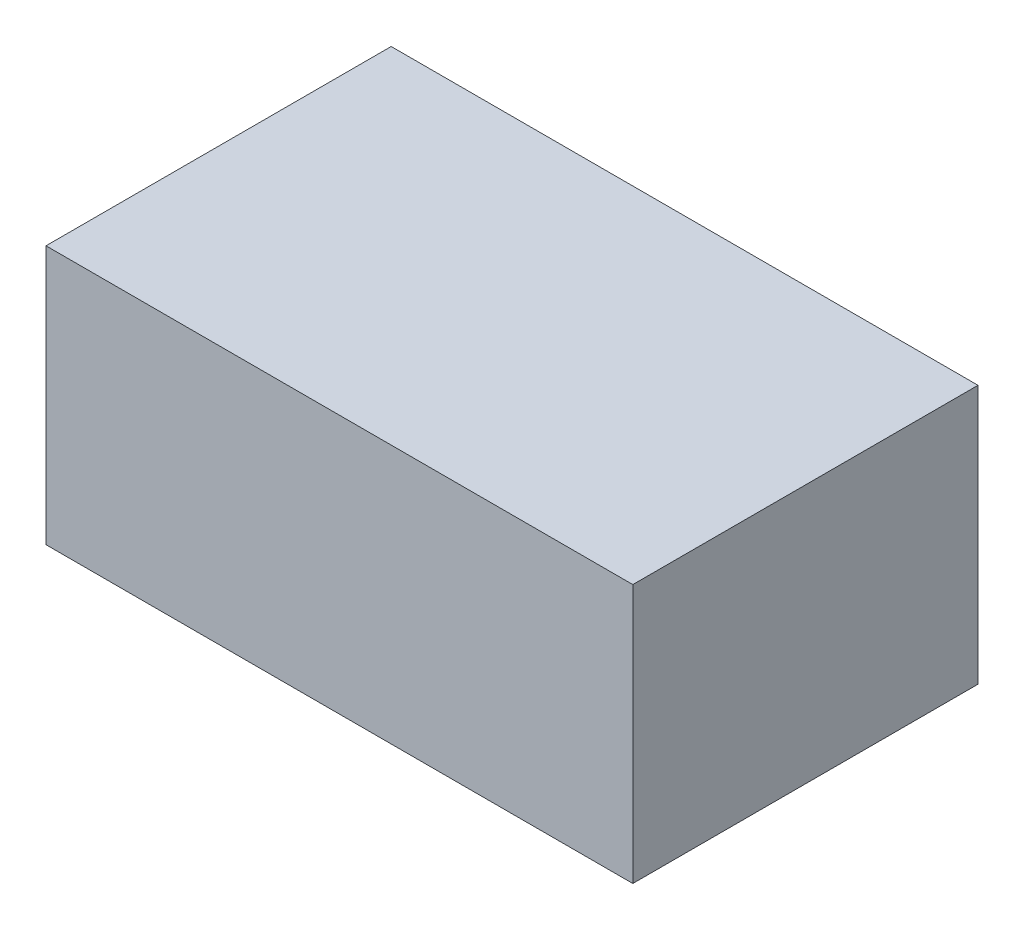
ISO-10303-21;
HEADER;
FILE_DESCRIPTION(('STEP AP214'),'2;1');
FILE_NAME('part.step','',(''),(''),'','','');
FILE_SCHEMA(('AUTOMOTIVE_DESIGN { 1 0 10303 214 1 1 1 1 }'));
ENDSEC;
DATA;
#1=APPLICATION_CONTEXT('core data for automotive mechanical design processes');
#2=APPLICATION_PROTOCOL_DEFINITION('international standard','automotive_design',2000,#1);
#3=PRODUCT_CONTEXT('',#1,'mechanical');
#4=PRODUCT('Part','Part','',(#3));
#5=PRODUCT_RELATED_PRODUCT_CATEGORY('part','',(#4));
#6=PRODUCT_DEFINITION_FORMATION('','',#4);
#7=PRODUCT_DEFINITION_CONTEXT('part definition',#1,'design');
#8=PRODUCT_DEFINITION('design','',#6,#7);
#9=PRODUCT_DEFINITION_SHAPE('','',#8);
#10=(LENGTH_UNIT() NAMED_UNIT(*) SI_UNIT(.MILLI.,.METRE.));
#11=(NAMED_UNIT(*) PLANE_ANGLE_UNIT() SI_UNIT($,.RADIAN.));
#12=(NAMED_UNIT(*) SI_UNIT($,.STERADIAN.) SOLID_ANGLE_UNIT());
#13=UNCERTAINTY_MEASURE_WITH_UNIT(LENGTH_MEASURE(1.E-05),#10,'distance_accuracy_value','');
#14=(GEOMETRIC_REPRESENTATION_CONTEXT(3) GLOBAL_UNCERTAINTY_ASSIGNED_CONTEXT((#13)) GLOBAL_UNIT_ASSIGNED_CONTEXT((#10,
#11,#12)) REPRESENTATION_CONTEXT('',''));
#15=CARTESIAN_POINT('',(0.,0.,0.));
#16=DIRECTION('',(0.,0.,1.));
#17=DIRECTION('',(1.,0.,0.));
#18=AXIS2_PLACEMENT_3D('',#15,#16,#17);
#19=CARTESIAN_POINT('',(34.,-15.,40.));
#20=DIRECTION('',(-1.,0.,0.));
#21=DIRECTION('',(0.,0.,1.));
#22=AXIS2_PLACEMENT_3D('',#19,#20,#21);
#23=PLANE('',#22);
#24=DIRECTION('',(0.,1.,0.));
#25=VECTOR('',#24,1.);
#26=CARTESIAN_POINT('',(34.,-15.,0.));
#27=LINE('',#26,#25);
#28=CARTESIAN_POINT('',(34.,-15.,0.));
#29=VERTEX_POINT('',#28);
#30=CARTESIAN_POINT('',(34.,15.,0.));
#31=VERTEX_POINT('',#30);
#32=EDGE_CURVE('E107',#29,#31,#27,.T.);
#33=ORIENTED_EDGE('',*,*,#32,.T.);
#34=DIRECTION('',(0.,0.,-1.));
#35=VECTOR('',#34,1.);
#36=CARTESIAN_POINT('',(34.,15.,40.));
#37=LINE('',#36,#35);
#38=CARTESIAN_POINT('',(34.,15.,40.));
#39=VERTEX_POINT('',#38);
#40=EDGE_CURVE('E11',#39,#31,#37,.T.);
#41=ORIENTED_EDGE('',*,*,#40,.F.);
#42=DIRECTION('',(0.,1.,0.));
#43=VECTOR('',#42,1.);
#44=CARTESIAN_POINT('',(34.,-15.,40.));
#45=LINE('',#44,#43);
#46=CARTESIAN_POINT('',(34.,-15.,40.));
#47=VERTEX_POINT('',#46);
#48=EDGE_CURVE('E91',#47,#39,#45,.T.);
#49=ORIENTED_EDGE('',*,*,#48,.F.);
#50=DIRECTION('',(0.,0.,-1.));
#51=VECTOR('',#50,1.);
#52=CARTESIAN_POINT('',(34.,-15.,40.));
#53=LINE('',#52,#51);
#54=EDGE_CURVE('E103',#47,#29,#53,.T.);
#55=ORIENTED_EDGE('',*,*,#54,.T.);
#56=EDGE_LOOP('',(#33,#41,#49,#55));
#57=FACE_BOUND('',#56,.T.);
#58=ADVANCED_FACE('F39',(#57),#23,.F.);
#59=CARTESIAN_POINT('',(-34.,15.,40.));
#60=DIRECTION('',(0.,-1.,0.));
#61=DIRECTION('',(0.,0.,-1.));
#62=AXIS2_PLACEMENT_3D('',#59,#60,#61);
#63=PLANE('',#62);
#64=DIRECTION('',(-1.,0.,0.));
#65=VECTOR('',#64,1.);
#66=CARTESIAN_POINT('',(-34.,15.,0.));
#67=LINE('',#66,#65);
#68=CARTESIAN_POINT('',(-34.,15.,0.));
#69=VERTEX_POINT('',#68);
#70=EDGE_CURVE('E96',#31,#69,#67,.T.);
#71=ORIENTED_EDGE('',*,*,#70,.T.);
#72=DIRECTION('',(0.,0.,-1.));
#73=VECTOR('',#72,1.);
#74=CARTESIAN_POINT('',(-34.,15.,40.));
#75=LINE('',#74,#73);
#76=CARTESIAN_POINT('',(-34.,15.,40.));
#77=VERTEX_POINT('',#76);
#78=EDGE_CURVE('E48',#77,#69,#75,.T.);
#79=ORIENTED_EDGE('',*,*,#78,.F.);
#80=DIRECTION('',(-1.,0.,0.));
#81=VECTOR('',#80,1.);
#82=CARTESIAN_POINT('',(-34.,15.,40.));
#83=LINE('',#82,#81);
#84=EDGE_CURVE('E86',#39,#77,#83,.T.);
#85=ORIENTED_EDGE('',*,*,#84,.F.);
#86=ORIENTED_EDGE('',*,*,#40,.T.);
#87=EDGE_LOOP('',(#71,#79,#85,#86));
#88=FACE_BOUND('',#87,.T.);
#89=ADVANCED_FACE('F95',(#88),#63,.F.);
#90=CARTESIAN_POINT('',(-34.,-15.,40.));
#91=DIRECTION('',(1.,0.,0.));
#92=DIRECTION('',(0.,0.,-1.));
#93=AXIS2_PLACEMENT_3D('',#90,#91,#92);
#94=PLANE('',#93);
#95=DIRECTION('',(0.,-1.,0.));
#96=VECTOR('',#95,1.);
#97=CARTESIAN_POINT('',(-34.,-15.,0.));
#98=LINE('',#97,#96);
#99=CARTESIAN_POINT('',(-34.,-15.,0.));
#100=VERTEX_POINT('',#99);
#101=EDGE_CURVE('E73',#69,#100,#98,.T.);
#102=ORIENTED_EDGE('',*,*,#101,.T.);
#103=DIRECTION('',(0.,0.,-1.));
#104=VECTOR('',#103,1.);
#105=CARTESIAN_POINT('',(-34.,-15.,40.));
#106=LINE('',#105,#104);
#107=CARTESIAN_POINT('',(-34.,-15.,40.));
#108=VERTEX_POINT('',#107);
#109=EDGE_CURVE('E98',#108,#100,#106,.T.);
#110=ORIENTED_EDGE('',*,*,#109,.F.);
#111=DIRECTION('',(0.,-1.,0.));
#112=VECTOR('',#111,1.);
#113=CARTESIAN_POINT('',(-34.,-15.,40.));
#114=LINE('',#113,#112);
#115=EDGE_CURVE('E89',#77,#108,#114,.T.);
#116=ORIENTED_EDGE('',*,*,#115,.F.);
#117=ORIENTED_EDGE('',*,*,#78,.T.);
#118=EDGE_LOOP('',(#102,#110,#116,#117));
#119=FACE_BOUND('',#118,.T.);
#120=ADVANCED_FACE('F99',(#119),#94,.F.);
#121=CARTESIAN_POINT('',(-34.,-15.,40.));
#122=DIRECTION('',(0.,1.,0.));
#123=DIRECTION('',(0.,0.,1.));
#124=AXIS2_PLACEMENT_3D('',#121,#122,#123);
#125=PLANE('',#124);
#126=DIRECTION('',(1.,0.,0.));
#127=VECTOR('',#126,1.);
#128=CARTESIAN_POINT('',(-34.,-15.,0.));
#129=LINE('',#128,#127);
#130=EDGE_CURVE('E79',#100,#29,#129,.T.);
#131=ORIENTED_EDGE('',*,*,#130,.T.);
#132=ORIENTED_EDGE('',*,*,#54,.F.);
#133=DIRECTION('',(1.,0.,0.));
#134=VECTOR('',#133,1.);
#135=CARTESIAN_POINT('',(-34.,-15.,40.));
#136=LINE('',#135,#134);
#137=EDGE_CURVE('E56',#108,#47,#136,.T.);
#138=ORIENTED_EDGE('',*,*,#137,.F.);
#139=ORIENTED_EDGE('',*,*,#109,.T.);
#140=EDGE_LOOP('',(#131,#132,#138,#139));
#141=FACE_BOUND('',#140,.T.);
#142=ADVANCED_FACE('F120',(#141),#125,.F.);
#143=CARTESIAN_POINT('',(0.,0.,40.));
#144=DIRECTION('',(0.,0.,-1.));
#145=DIRECTION('',(-1.,0.,0.));
#146=AXIS2_PLACEMENT_3D('',#143,#144,#145);
#147=PLANE('',#146);
#148=ORIENTED_EDGE('',*,*,#48,.T.);
#149=ORIENTED_EDGE('',*,*,#84,.T.);
#150=ORIENTED_EDGE('',*,*,#115,.T.);
#151=ORIENTED_EDGE('',*,*,#137,.T.);
#152=EDGE_LOOP('',(#148,#149,#150,#151));
#153=FACE_BOUND('',#152,.T.);
#154=ADVANCED_FACE('F87',(#153),#147,.F.);
#155=CARTESIAN_POINT('',(0.,0.,0.));
#156=DIRECTION('',(0.,0.,-1.));
#157=DIRECTION('',(-1.,0.,0.));
#158=AXIS2_PLACEMENT_3D('',#155,#156,#157);
#159=PLANE('',#158);
#160=ORIENTED_EDGE('',*,*,#32,.F.);
#161=ORIENTED_EDGE('',*,*,#130,.F.);
#162=ORIENTED_EDGE('',*,*,#101,.F.);
#163=ORIENTED_EDGE('',*,*,#70,.F.);
#164=EDGE_LOOP('',(#160,#161,#162,#163));
#165=FACE_BOUND('',#164,.T.);
#166=ADVANCED_FACE('F123',(#165),#159,.T.);
#167=CLOSED_SHELL('',(#58,#89,#120,#142,#154,#166));
#168=MANIFOLD_SOLID_BREP('B2',#167);
#169=ADVANCED_BREP_SHAPE_REPRESENTATION('',(#18,#168),#14);
#170=SHAPE_DEFINITION_REPRESENTATION(#9,#169);
ENDSEC;
END-ISO-10303-21;
